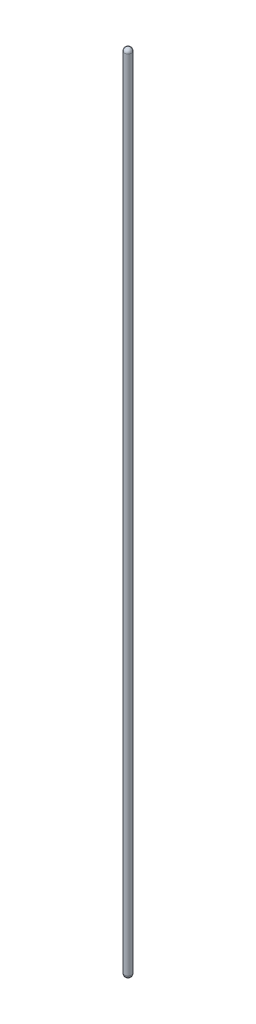
ISO-10303-21;
HEADER;
FILE_DESCRIPTION(('STEP AP214'),'2;1');
FILE_NAME('part.step','',(''),(''),'','','');
FILE_SCHEMA(('AUTOMOTIVE_DESIGN { 1 0 10303 214 1 1 1 1 }'));
ENDSEC;
DATA;
#1=APPLICATION_CONTEXT('core data for automotive mechanical design processes');
#2=APPLICATION_PROTOCOL_DEFINITION('international standard','automotive_design',2000,#1);
#3=PRODUCT_CONTEXT('',#1,'mechanical');
#4=PRODUCT('Part','Part','',(#3));
#5=PRODUCT_RELATED_PRODUCT_CATEGORY('part','',(#4));
#6=PRODUCT_DEFINITION_FORMATION('','',#4);
#7=PRODUCT_DEFINITION_CONTEXT('part definition',#1,'design');
#8=PRODUCT_DEFINITION('design','',#6,#7);
#9=PRODUCT_DEFINITION_SHAPE('','',#8);
#10=(LENGTH_UNIT() NAMED_UNIT(*) SI_UNIT(.MILLI.,.METRE.));
#11=(NAMED_UNIT(*) PLANE_ANGLE_UNIT() SI_UNIT($,.RADIAN.));
#12=(NAMED_UNIT(*) SI_UNIT($,.STERADIAN.) SOLID_ANGLE_UNIT());
#13=UNCERTAINTY_MEASURE_WITH_UNIT(LENGTH_MEASURE(1.E-05),#10,'distance_accuracy_value','');
#14=(GEOMETRIC_REPRESENTATION_CONTEXT(3) GLOBAL_UNCERTAINTY_ASSIGNED_CONTEXT((#13)) GLOBAL_UNIT_ASSIGNED_CONTEXT((#10,
#11,#12)) REPRESENTATION_CONTEXT('',''));
#15=CARTESIAN_POINT('',(0.,0.,0.));
#16=DIRECTION('',(0.,0.,1.));
#17=DIRECTION('',(1.,0.,0.));
#18=AXIS2_PLACEMENT_3D('',#15,#16,#17);
#19=CARTESIAN_POINT('',(-1.23165366794353E-13,1000.,0.));
#20=DIRECTION('',(0.,1.,0.));
#21=DIRECTION('',(1.,0.,0.));
#22=AXIS2_PLACEMENT_3D('',#19,#20,#21);
#23=SPHERICAL_SURFACE('',#22,8.99999999999983);
#24=CARTESIAN_POINT('',(0.,1000.,0.));
#25=DIRECTION('',(0.,1.,0.));
#26=DIRECTION('',(0.,0.,1.));
#27=AXIS2_PLACEMENT_3D('',#24,#25,#26);
#28=CIRCLE('',#27,8.99999999999988);
#29=CARTESIAN_POINT('',(0.,1000.,8.99999999999988));
#30=VERTEX_POINT('',#29);
#31=EDGE_CURVE('E43',#30,#30,#28,.T.);
#32=ORIENTED_EDGE('',*,*,#31,.T.);
#33=EDGE_LOOP('',(#32));
#34=FACE_BOUND('',#33,.T.);
#35=ADVANCED_FACE('F37',(#34),#23,.T.);
#36=CARTESIAN_POINT('',(1.22464679914735E-13,-1000.,0.));
#37=DIRECTION('',(0.,1.,0.));
#38=DIRECTION('',(-1.,0.,0.));
#39=AXIS2_PLACEMENT_3D('',#36,#37,#38);
#40=SPHERICAL_SURFACE('',#39,8.99999999999995);
#41=CARTESIAN_POINT('',(0.,-1000.,0.));
#42=DIRECTION('',(0.,1.,0.));
#43=DIRECTION('',(0.,0.,1.));
#44=AXIS2_PLACEMENT_3D('',#41,#42,#43);
#45=CIRCLE('',#44,8.99999999999988);
#46=CARTESIAN_POINT('',(0.,-1000.,8.99999999999988));
#47=VERTEX_POINT('',#46);
#48=EDGE_CURVE('E10',#47,#47,#45,.T.);
#49=ORIENTED_EDGE('',*,*,#48,.F.);
#50=EDGE_LOOP('',(#49));
#51=FACE_BOUND('',#50,.T.);
#52=ADVANCED_FACE('F52',(#51),#40,.T.);
#53=CARTESIAN_POINT('',(0.,3.93541352491792,0.));
#54=DIRECTION('',(0.,1.,0.));
#55=DIRECTION('',(0.,0.,1.));
#56=AXIS2_PLACEMENT_3D('',#53,#54,#55);
#57=CYLINDRICAL_SURFACE('',#56,8.99999999999988);
#58=ORIENTED_EDGE('',*,*,#48,.T.);
#59=EDGE_LOOP('',(#58));
#60=FACE_BOUND('',#59,.T.);
#61=ORIENTED_EDGE('',*,*,#31,.F.);
#62=EDGE_LOOP('',(#61));
#63=FACE_BOUND('',#62,.T.);
#64=ADVANCED_FACE('F50',(#60,#63),#57,.T.);
#65=CLOSED_SHELL('',(#35,#52,#64));
#66=MANIFOLD_SOLID_BREP('B2',#65);
#67=ADVANCED_BREP_SHAPE_REPRESENTATION('',(#18,#66),#14);
#68=SHAPE_DEFINITION_REPRESENTATION(#9,#67);
ENDSEC;
END-ISO-10303-21;
